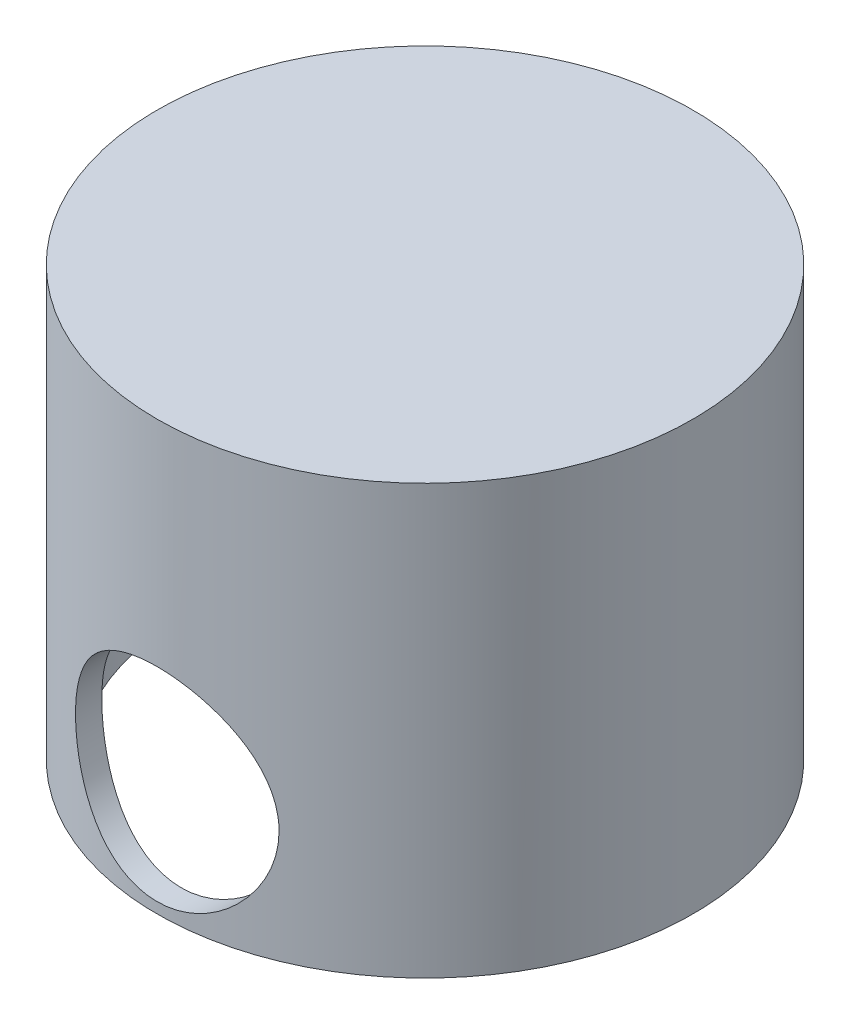
ISO-10303-21;
HEADER;
FILE_DESCRIPTION(('STEP AP214'),'2;1');
FILE_NAME('part.step','',(''),(''),'','','');
FILE_SCHEMA(('AUTOMOTIVE_DESIGN { 1 0 10303 214 1 1 1 1 }'));
ENDSEC;
DATA;
#1=APPLICATION_CONTEXT('core data for automotive mechanical design processes');
#2=APPLICATION_PROTOCOL_DEFINITION('international standard','automotive_design',2000,#1);
#3=PRODUCT_CONTEXT('',#1,'mechanical');
#4=PRODUCT('Part','Part','',(#3));
#5=PRODUCT_RELATED_PRODUCT_CATEGORY('part','',(#4));
#6=PRODUCT_DEFINITION_FORMATION('','',#4);
#7=PRODUCT_DEFINITION_CONTEXT('part definition',#1,'design');
#8=PRODUCT_DEFINITION('design','',#6,#7);
#9=PRODUCT_DEFINITION_SHAPE('','',#8);
#10=(LENGTH_UNIT() NAMED_UNIT(*) SI_UNIT(.MILLI.,.METRE.));
#11=(NAMED_UNIT(*) PLANE_ANGLE_UNIT() SI_UNIT($,.RADIAN.));
#12=(NAMED_UNIT(*) SI_UNIT($,.STERADIAN.) SOLID_ANGLE_UNIT());
#13=UNCERTAINTY_MEASURE_WITH_UNIT(LENGTH_MEASURE(1.E-05),#10,'distance_accuracy_value','');
#14=(GEOMETRIC_REPRESENTATION_CONTEXT(3) GLOBAL_UNCERTAINTY_ASSIGNED_CONTEXT((#13)) GLOBAL_UNIT_ASSIGNED_CONTEXT((#10,
#11,#12)) REPRESENTATION_CONTEXT('',''));
#15=CARTESIAN_POINT('',(0.,0.,0.));
#16=DIRECTION('',(0.,0.,1.));
#17=DIRECTION('',(1.,0.,0.));
#18=AXIS2_PLACEMENT_3D('',#15,#16,#17);
#19=CARTESIAN_POINT('',(0.,2.1,-5.));
#20=DIRECTION('',(0.,0.,1.));
#21=DIRECTION('',(1.,0.,0.));
#22=AXIS2_PLACEMENT_3D('',#19,#20,#21);
#23=CYLINDRICAL_SURFACE('',#22,1.9);
#24=DIRECTION('',(0.,0.,1.));
#25=VECTOR('',#24,1.);
#26=CARTESIAN_POINT('',(1.9,2.1,-5.));
#27=LINE('',#26,#25);
#28=CARTESIAN_POINT('',(1.9,2.1,-4.13430768085782));
#29=VERTEX_POINT('',#28);
#30=CARTESIAN_POINT('',(1.9,2.1,-4.62493243193887));
#31=VERTEX_POINT('',#30);
#32=EDGE_CURVE('E11',#29,#31,#27,.F.);
#33=ORIENTED_EDGE('',*,*,#32,.F.);
#34=CARTESIAN_POINT('',(0.,4.,-4.55));
#35=CARTESIAN_POINT('',(-0.101757167960576,3.9999889795849,-4.54999170850312));
#36=CARTESIAN_POINT('',(-0.203673371409378,3.99177693213572,-4.5465468918561));
#37=CARTESIAN_POINT('',(-0.404616385894816,3.95922077473532,-4.53309978978712));
#38=CARTESIAN_POINT('',(-0.503634972840385,3.93483467006331,-4.52308043479505));
#39=CARTESIAN_POINT('',(-0.695546176948673,3.87098905312328,-4.49756060096493));
#40=CARTESIAN_POINT('',(-0.788458342399915,3.83158069423824,-4.48207873608777));
#41=CARTESIAN_POINT('',(-0.96626256089563,3.7390208168186,-4.4471404091814));
#42=CARTESIAN_POINT('',(-1.05115701317986,3.68587342748924,-4.42768514170909));
#43=CARTESIAN_POINT('',(-1.2149286070869,3.56451621026312,-4.38564967784379));
#44=CARTESIAN_POINT('',(-1.2933487937799,3.49572558621654,-4.36296685170919));
#45=CARTESIAN_POINT('',(-1.43793251273584,3.34626276203829,-4.31747682569336));
#46=CARTESIAN_POINT('',(-1.50408956529537,3.26558432069696,-4.2946695665777));
#47=CARTESIAN_POINT('',(-1.62550335648133,3.08979827894359,-4.25025047951916));
#48=CARTESIAN_POINT('',(-1.68005895737734,2.99417431294387,-4.22875360419994));
#49=CARTESIAN_POINT('',(-1.77210709185766,2.7940793141977,-4.19101774379538));
#50=CARTESIAN_POINT('',(-1.80960845381103,2.68961289217239,-4.1747760395553));
#51=CARTESIAN_POINT('',(-1.86459451231666,2.48005802800511,-4.15050075712562));
#52=CARTESIAN_POINT('',(-1.88295887434288,2.37524356498495,-4.14210847599587));
#53=CARTESIAN_POINT('',(-1.90189382720715,2.16371077257113,-4.13345132468412));
#54=CARTESIAN_POINT('',(-1.902474293208,2.05699353270855,-4.13318194396401));
#55=CARTESIAN_POINT('',(-1.88648733592977,1.85346444730835,-4.14049758914471));
#56=CARTESIAN_POINT('',(-1.87123789727642,1.75652301089003,-4.14747894714587));
#57=CARTESIAN_POINT('',(-1.82623548584867,1.56672697765497,-4.16748891838456));
#58=CARTESIAN_POINT('',(-1.79647972110963,1.47387317131766,-4.18051869570993));
#59=CARTESIAN_POINT('',(-1.72272870001075,1.2925381245053,-4.21145201164279));
#60=CARTESIAN_POINT('',(-1.6784433333412,1.20419234499232,-4.22945355276891));
#61=CARTESIAN_POINT('',(-1.57709542377698,1.03584147997092,-4.26827952121988));
#62=CARTESIAN_POINT('',(-1.52002782955916,0.955839710245205,-4.28910506325543));
#63=CARTESIAN_POINT('',(-1.38904666480913,0.799297478555745,-4.33338389069071));
#64=CARTESIAN_POINT('',(-1.31411407931078,0.723627857703208,-4.35691014359209));
#65=CARTESIAN_POINT('',(-1.15239040690445,0.585635969571268,-4.40244803025189));
#66=CARTESIAN_POINT('',(-1.06559652575458,0.52331685626562,-4.42445930527452));
#67=CARTESIAN_POINT('',(-0.879957718349402,0.412510278329133,-4.46513139551705));
#68=CARTESIAN_POINT('',(-0.780879316950429,0.364378516750206,-4.48370230168852));
#69=CARTESIAN_POINT('',(-0.57505818498804,0.285771696418451,-4.51471053188253));
#70=CARTESIAN_POINT('',(-0.468319746428538,0.255286835399547,-4.52715126044226));
#71=CARTESIAN_POINT('',(-0.257484682399281,0.214665303488662,-4.54386054906135));
#72=CARTESIAN_POINT('',(-0.153650301043173,0.203360044435745,-4.54859763790352));
#73=CARTESIAN_POINT('',(0.0545315203191366,0.197932876602209,-4.55086253695219));
#74=CARTESIAN_POINT('',(0.158878803514811,0.203806006847307,-4.54839242853713));
#75=CARTESIAN_POINT('',(0.359642188179475,0.23173361848524,-4.53682417229059));
#76=CARTESIAN_POINT('',(0.456194247302778,0.252966144290898,-4.52806286584631));
#77=CARTESIAN_POINT('',(0.644259575701315,0.309864436431063,-4.50515369227797));
#78=CARTESIAN_POINT('',(0.735772207424184,0.345532024242481,-4.49100514538257));
#79=CARTESIAN_POINT('',(0.914372088887248,0.43145275537197,-4.45813067412324));
#80=CARTESIAN_POINT('',(1.00123338093964,0.482124786917805,-4.43927614505565));
#81=CARTESIAN_POINT('',(1.16553113437644,0.596155888338426,-4.39900035803063));
#82=CARTESIAN_POINT('',(1.24296363139076,0.659520265341447,-4.37757802789261));
#83=CARTESIAN_POINT('',(1.39204722706612,0.802456974479751,-4.33257393260414));
#84=CARTESIAN_POINT('',(1.46288460450262,0.882866140923004,-4.30894752657324));
#85=CARTESIAN_POINT('',(1.59028881663302,1.0548049569854,-4.2635743935834));
#86=CARTESIAN_POINT('',(1.64685235733206,1.14633716627881,-4.24182810126091));
#87=CARTESIAN_POINT('',(1.74472893227999,1.33984296017846,-4.20252961882294));
#88=CARTESIAN_POINT('',(1.78580869171692,1.44194881530045,-4.18504288675471));
#89=CARTESIAN_POINT('',(1.84984150114795,1.65258851632637,-4.15714193714009));
#90=CARTESIAN_POINT('',(1.8728095866381,1.7611169498519,-4.14672185418804));
#91=CARTESIAN_POINT('',(1.89846974756926,1.97248782936933,-4.13503242267552));
#92=CARTESIAN_POINT('',(1.90259102625123,2.07512190415627,-4.13311838719631));
#93=CARTESIAN_POINT('',(1.89425948511743,2.27955904421061,-4.13694365574339));
#94=CARTESIAN_POINT('',(1.88180923673045,2.38136223594131,-4.14268177237398));
#95=CARTESIAN_POINT('',(1.84189034924779,2.57632054160889,-4.16057445974201));
#96=CARTESIAN_POINT('',(1.81515446768803,2.66965726649533,-4.17241504348956));
#97=CARTESIAN_POINT('',(1.74814138788099,2.85054069180757,-4.20093092118913));
#98=CARTESIAN_POINT('',(1.70786038117534,2.93808575550838,-4.21760757470848));
#99=CARTESIAN_POINT('',(1.61210485242072,3.11066094857504,-4.25516286336975));
#100=CARTESIAN_POINT('',(1.55586087180969,3.19522141553677,-4.27623418824468));
#101=CARTESIAN_POINT('',(1.43085094651685,3.35415137715043,-4.31966905176211));
#102=CARTESIAN_POINT('',(1.36208062929742,3.42851729728029,-4.34203303976458));
#103=CARTESIAN_POINT('',(1.20798687649364,3.57055527060711,-4.38750210577242));
#104=CARTESIAN_POINT('',(1.12181966034007,3.63733728738289,-4.41054137295093));
#105=CARTESIAN_POINT('',(0.93864854177069,3.75554084710515,-4.45311875019328));
#106=CARTESIAN_POINT('',(0.84163973207037,3.80695539519317,-4.47265526428412));
#107=CARTESIAN_POINT('',(0.641027894236107,3.89185865375826,-4.50574656464846));
#108=CARTESIAN_POINT('',(0.53755904042552,3.92562741593749,-4.5193941626519));
#109=CARTESIAN_POINT('',(0.325906955654656,3.97497075796387,-4.53954766076462));
#110=CARTESIAN_POINT('',(0.217739584923597,3.9906022583564,-4.54607589980727));
#111=CARTESIAN_POINT('',(0.0727936798049418,3.99895808127257,-4.54956602726438));
#112=CARTESIAN_POINT('',(0.0364070188825854,4.00000394292086,-4.5500029665594));
#113=CARTESIAN_POINT('',(0.,4.,-4.55));
#114=B_SPLINE_CURVE_WITH_KNOTS('',3,(#34,#35,#36,#37,#38,#39,#40,#41,#42,#43,#44,#45,#46,#47,
#48,#49,#50,#51,#52,#53,#54,#55,#56,#57,#58,#59,#60,#61,#62,#63,#64,#65,#66,#67,#68,#69,#70,#71,
#72,#73,#74,#75,#76,#77,#78,#79,#80,#81,#82,#83,#84,#85,#86,#87,#88,#89,#90,#91,#92,#93,#94,#95,
#96,#97,#98,#99,#100,#101,#102,#103,#104,#105,#106,#107,#108,#109,#110,#111,#112,#113),
.UNSPECIFIED.,.T.,.F.,(4,2,2,2,2,2,2,2,2,2,2,2,2,2,2,2,2,2,2,2,2,2,2,2,2,2,2,2,2,2,2,2,2,2,2,2,
2,2,2,4),(0.,0.305167542847808,0.611130548354442,0.916060871304406,1.22089965511848,
1.53977252768732,1.85881341181118,2.19363714439877,2.52828735287146,2.84676687086272,
3.16506953817286,3.45884351782363,3.75267406111158,4.05277019531574,4.35298513240328,
4.67869399761883,5.00447972486523,5.33784834015083,5.67103160213475,5.98306984559692,
6.2950179839382,6.59140210527351,6.88782363727174,7.19345849820491,7.49922142389637,
7.82692788103995,8.15470989448137,8.48724959804015,8.81951295063518,9.12611005270941,
9.43265958519566,9.72481283008288,10.017048287951,10.3268986159551,10.6368573106543,
10.9695327374709,11.3023593593995,11.6297297475084,11.9560699394894,12.0652538006118),.UNSPECIFIED.);
#115=CARTESIAN_POINT('',(-1.9,2.1,-4.13430768085782));
#116=VERTEX_POINT('',#115);
#117=EDGE_CURVE('E96',#29,#116,#114,.T.);
#118=ORIENTED_EDGE('',*,*,#117,.T.);
#119=DIRECTION('',(0.,0.,1.));
#120=VECTOR('',#119,1.);
#121=CARTESIAN_POINT('',(-1.9,2.1,-5.));
#122=LINE('',#121,#120);
#123=CARTESIAN_POINT('',(-1.9,2.1,-4.62493243193887));
#124=VERTEX_POINT('',#123);
#125=EDGE_CURVE('E52',#116,#124,#122,.F.);
#126=ORIENTED_EDGE('',*,*,#125,.T.);
#127=CARTESIAN_POINT('',(0.,4.,-5.));
#128=CARTESIAN_POINT('',(-0.102799946037765,4.00000415381577,-5.00000314148827));
#129=CARTESIAN_POINT('',(-0.205571843604519,3.99163106638686,-4.99680228989486));
#130=CARTESIAN_POINT('',(-0.408038934279459,3.95849983997184,-4.98435404669264));
#131=CARTESIAN_POINT('',(-0.507734657550122,3.93374454106912,-4.97510770315697));
#132=CARTESIAN_POINT('',(-0.701099790647796,3.86885442206358,-4.9515593739685));
#133=CARTESIAN_POINT('',(-0.79478059792097,3.82874975542084,-4.93726730476453));
#134=CARTESIAN_POINT('',(-0.974076337852587,3.73445483907035,-4.90504670913707));
#135=CARTESIAN_POINT('',(-1.05968903835505,3.68026070680921,-4.88711718065938));
#136=CARTESIAN_POINT('',(-1.22413732997016,3.55686832356389,-4.84859789590344));
#137=CARTESIAN_POINT('',(-1.30257632185067,3.48716568208657,-4.82793146758365));
#138=CARTESIAN_POINT('',(-1.44697300442312,3.3358056302591,-4.7866396882284));
#139=CARTESIAN_POINT('',(-1.51292672431606,3.25414443122143,-4.76601435231863));
#140=CARTESIAN_POINT('',(-1.63303669782607,3.07727075960727,-4.72624148165763));
#141=CARTESIAN_POINT('',(-1.68662691351059,2.98165162326601,-4.70718397732858));
#142=CARTESIAN_POINT('',(-1.77678814062093,2.7819199845924,-4.67390104311853));
#143=CARTESIAN_POINT('',(-1.81336615777595,2.67781099922898,-4.65967362483106));
#144=CARTESIAN_POINT('',(-1.86688935206445,2.46862490700633,-4.63848318884947));
#145=CARTESIAN_POINT('',(-1.88459286653868,2.36377110298857,-4.63124079326371));
#146=CARTESIAN_POINT('',(-1.9022352797225,2.15235007582175,-4.62402433436697));
#147=CARTESIAN_POINT('',(-1.90218177025023,2.04578360439116,-4.62404716488918));
#148=CARTESIAN_POINT('',(-1.88489047329825,1.84096675039133,-4.63111820371223));
#149=CARTESIAN_POINT('',(-1.86871346296971,1.74260903735178,-4.63773273521278));
#150=CARTESIAN_POINT('',(-1.82139096396027,1.55012621654266,-4.65651975451297));
#151=CARTESIAN_POINT('',(-1.79024315879619,1.45600176626622,-4.66869310243304));
#152=CARTESIAN_POINT('',(-1.71329420545471,1.27252628717701,-4.69748147158025));
#153=CARTESIAN_POINT('',(-1.66722275924216,1.18330187807791,-4.71417741416087));
#154=CARTESIAN_POINT('',(-1.56192297174274,1.01354614235758,-4.75010374416888));
#155=CARTESIAN_POINT('',(-1.50269000311216,0.933017887974257,-4.76933502200296));
#156=CARTESIAN_POINT('',(-1.36792669110658,0.777081147725488,-4.80978709665352));
#157=CARTESIAN_POINT('',(-1.29155254717806,0.702411903464446,-4.83105350406012));
#158=CARTESIAN_POINT('',(-1.12712495183049,0.566718062548023,-4.87203874292135));
#159=CARTESIAN_POINT('',(-1.03906961144241,0.505695677025057,-4.89175732325386));
#160=CARTESIAN_POINT('',(-0.851852487995204,0.398182901674937,-4.92783612775859));
#161=CARTESIAN_POINT('',(-0.752533399397337,0.351944926685268,-4.94413653388479));
#162=CARTESIAN_POINT('',(-0.546752117350479,0.277080814368303,-4.97109705743368));
#163=CARTESIAN_POINT('',(-0.440293209930096,0.248446635933624,-4.98175974975373));
#164=CARTESIAN_POINT('',(-0.229470984419311,0.211038505057338,-4.9957875569285));
#165=CARTESIAN_POINT('',(-0.125308381952605,0.201269485913397,-4.99951788872478));
#166=CARTESIAN_POINT('',(0.0832228861010048,0.198963572059508,-5.00039355163115));
#167=CARTESIAN_POINT('',(0.187591499072482,0.206422734110037,-4.99754038959186));
#168=CARTESIAN_POINT('',(0.389231183311322,0.23760974501933,-4.98581030398745));
#169=CARTESIAN_POINT('',(0.48661956252922,0.260680395127365,-4.97717686326153));
#170=CARTESIAN_POINT('',(0.676070523965439,0.32156453246959,-4.95500073108836));
#171=CARTESIAN_POINT('',(0.768132412531035,0.359379934927776,-4.9414574019024));
#172=CARTESIAN_POINT('',(0.947380130569953,0.449893671543217,-4.91029493799233));
#173=CARTESIAN_POINT('',(1.0343402755648,0.503000255035508,-4.89256680627251));
#174=CARTESIAN_POINT('',(1.19840935888328,0.62212916627088,-4.85498822454556));
#175=CARTESIAN_POINT('',(1.27551457482178,0.688156350664691,-4.83513697776912));
#176=CARTESIAN_POINT('',(1.42249454419624,0.835879744125506,-4.79402533228151));
#177=CARTESIAN_POINT('',(1.4916645142899,0.918275267856926,-4.77275146045522));
#178=CARTESIAN_POINT('',(1.61534182230436,1.09391495424199,-4.73232674163432));
#179=CARTESIAN_POINT('',(1.66984764881774,1.18716023374311,-4.71317611359821));
#180=CARTESIAN_POINT('',(1.76275609269656,1.38273799327669,-4.67922676081744));
#181=CARTESIAN_POINT('',(1.80107453812967,1.48511469919419,-4.66445090027486));
#182=CARTESIAN_POINT('',(1.85966772399062,1.69558842965986,-4.64140564627876));
#183=CARTESIAN_POINT('',(1.87995403901349,1.80368173750899,-4.63313207948134));
#184=CARTESIAN_POINT('',(1.90085822079159,2.01486049983041,-4.62459224889872));
#185=CARTESIAN_POINT('',(1.90268207203628,2.11780766486938,-4.62383507549612));
#186=CARTESIAN_POINT('',(1.88971442556339,2.32246053023351,-4.62914978373433));
#187=CARTESIAN_POINT('',(1.87492459303962,2.42416635394587,-4.63522098096587));
#188=CARTESIAN_POINT('',(1.83009780463443,2.62011989436956,-4.65309482864238));
#189=CARTESIAN_POINT('',(1.80056695115268,2.71450229881234,-4.66470670311429));
#190=CARTESIAN_POINT('',(1.72754746605826,2.89702476865041,-4.69223770514172));
#191=CARTESIAN_POINT('',(1.68405526209124,2.98516322932584,-4.70815793493193));
#192=CARTESIAN_POINT('',(1.5816535247205,3.15781732736853,-4.74356958481196));
#193=CARTESIAN_POINT('',(1.52204449455647,3.24188789304858,-4.76320634926203));
#194=CARTESIAN_POINT('',(1.39017194395784,3.39921747533249,-4.80334974018232));
#195=CARTESIAN_POINT('',(1.3179043471688,3.47247299519233,-4.82385664524132));
#196=CARTESIAN_POINT('',(1.15791728108036,3.61029299174753,-4.86481333859486));
#197=CARTESIAN_POINT('',(1.06955792182773,3.67413824127065,-4.88519522839751));
#198=CARTESIAN_POINT('',(0.88264599508179,3.78606111869897,-4.92239876122345));
#199=CARTESIAN_POINT('',(0.784092165900098,3.83413679185081,-4.93921996278201));
#200=CARTESIAN_POINT('',(0.573841256525993,3.91495483162383,-4.96815335096176));
#201=CARTESIAN_POINT('',(0.461720234475095,3.94671559467441,-4.97995793401086));
#202=CARTESIAN_POINT('',(0.233052523820141,3.98923018017531,-4.99587741203959));
#203=CARTESIAN_POINT('',(0.11650824805077,3.99999529227576,-4.99999643959643));
#204=CARTESIAN_POINT('',(0.,4.,-5.));
#205=B_SPLINE_CURVE_WITH_KNOTS('',3,(#127,#128,#129,#130,#131,#132,#133,#134,#135,#136,#137,
#138,#139,#140,#141,#142,#143,#144,#145,#146,#147,#148,#149,#150,#151,#152,#153,#154,#155,#156,
#157,#158,#159,#160,#161,#162,#163,#164,#165,#166,#167,#168,#169,#170,#171,#172,#173,#174,#175,
#176,#177,#178,#179,#180,#181,#182,#183,#184,#185,#186,#187,#188,#189,#190,#191,#192,#193,#194,
#195,#196,#197,#198,#199,#200,#201,#202,#203,#204),.UNSPECIFIED.,.T.,.F.,(4,2,2,2,2,2,2,2,2,2,2,
2,2,2,2,2,2,2,2,2,2,2,2,2,2,2,2,2,2,2,2,2,2,2,2,2,2,2,4),(0.,0.307969989814319,
0.615886602745027,0.923201400237974,1.2306009726375,1.55003648986385,1.86957342987414,
2.20167819314484,2.53364607224951,2.85170573798024,3.16962942101276,3.46793160007379,
3.76627995133595,4.07036626171805,4.37455965276768,4.69979074570955,5.02507449610576,
5.35564718353277,5.68606875870782,5.99852705660325,6.31091384516212,6.6109067417509,
6.91093861797689,7.21987153759843,7.52892080407884,7.85638861100008,8.18389015653176,
8.51307430166362,8.84204699477762,9.14938038628981,9.45668297644511,9.75409402108917,
10.0515812263923,10.3649606558095,10.6784411868815,11.0095285310712,11.3406569004431,
11.6898823114545,12.0389198873331),.UNSPECIFIED.);
#206=EDGE_CURVE('E109',#31,#124,#205,.T.);
#207=ORIENTED_EDGE('',*,*,#206,.F.);
#208=EDGE_LOOP('',(#33,#118,#126,#207));
#209=FACE_BOUND('',#208,.T.);
#210=ADVANCED_FACE('F42',(#209),#23,.F.);
#211=CARTESIAN_POINT('',(0.,8.,0.));
#212=DIRECTION('',(0.,-1.,0.));
#213=DIRECTION('',(0.,0.,-1.));
#214=AXIS2_PLACEMENT_3D('',#211,#212,#213);
#215=CYLINDRICAL_SURFACE('',#214,5.);
#216=CARTESIAN_POINT('',(0.,0.,0.));
#217=DIRECTION('',(0.,1.,0.));
#218=DIRECTION('',(0.,0.,1.));
#219=AXIS2_PLACEMENT_3D('',#216,#217,#218);
#220=CIRCLE('',#219,5.);
#221=CARTESIAN_POINT('',(-1.9,0.,-4.62493243193887));
#222=VERTEX_POINT('',#221);
#223=CARTESIAN_POINT('',(1.9,0.,-4.62493243193887));
#224=VERTEX_POINT('',#223);
#225=EDGE_CURVE('E150',#222,#224,#220,.T.);
#226=ORIENTED_EDGE('',*,*,#225,.T.);
#227=DIRECTION('',(0.,-1.,0.));
#228=VECTOR('',#227,1.);
#229=CARTESIAN_POINT('',(1.9,8.,-4.62493243193887));
#230=LINE('',#229,#228);
#231=EDGE_CURVE('E112',#224,#31,#230,.F.);
#232=ORIENTED_EDGE('',*,*,#231,.T.);
#233=ORIENTED_EDGE('',*,*,#206,.T.);
#234=DIRECTION('',(0.,-1.,0.));
#235=VECTOR('',#234,1.);
#236=CARTESIAN_POINT('',(-1.9,8.,-4.62493243193887));
#237=LINE('',#236,#235);
#238=EDGE_CURVE('E59',#124,#222,#237,.T.);
#239=ORIENTED_EDGE('',*,*,#238,.T.);
#240=EDGE_LOOP('',(#226,#232,#233,#239));
#241=FACE_BOUND('',#240,.T.);
#242=CARTESIAN_POINT('',(1.9,2.1,4.62493243193887));
#243=CARTESIAN_POINT('',(1.90000436371933,1.9975038261634,4.62492829804688));
#244=CARTESIAN_POINT('',(1.89167872526175,1.89503593892056,4.62837659192631));
#245=CARTESIAN_POINT('',(1.85875324714,1.69319611435051,4.64169676380714));
#246=CARTESIAN_POINT('',(1.83415423094239,1.59382402063615,4.65156831677793));
#247=CARTESIAN_POINT('',(1.76972022747258,1.40114946112929,4.67645875021947));
#248=CARTESIAN_POINT('',(1.72992262911404,1.30783275281394,4.69146498987563));
#249=CARTESIAN_POINT('',(1.63635411050526,1.12916386760437,4.72491334314176));
#250=CARTESIAN_POINT('',(1.58257887568518,1.04381416101306,4.74335651715464));
#251=CARTESIAN_POINT('',(1.45964054880322,0.879143312499456,4.78265569638879));
#252=CARTESIAN_POINT('',(1.38987879516366,0.800286242306532,4.80358397927604));
#253=CARTESIAN_POINT('',(1.23821697454002,0.655062117415982,4.84489323856624));
#254=CARTESIAN_POINT('',(1.15631423523436,0.58869781978909,4.86527409330664));
#255=CARTESIAN_POINT('',(0.979156193501865,0.468090568785464,4.90405417834482));
#256=CARTESIAN_POINT('',(0.883533318585693,0.414354400385029,4.92235883280295));
#257=CARTESIAN_POINT('',(0.683785914181913,0.323924866971467,4.95405298729702));
#258=CARTESIAN_POINT('',(0.579664434268371,0.287225419969773,4.9674442410237));
#259=CARTESIAN_POINT('',(0.370755986482196,0.233545751921985,4.98728948637783));
#260=CARTESIAN_POINT('',(0.266201595779875,0.215766061526339,4.99402379560313));
#261=CARTESIAN_POINT('',(0.0553906936457078,0.197866496563972,5.00080378714205));
#262=CARTESIAN_POINT('',(-0.0508652375897353,0.197740725359082,5.00085170279789));
#263=CARTESIAN_POINT('',(-0.256323260168012,0.214692347151359,4.99443029769439));
#264=CARTESIAN_POINT('',(-0.355609552301661,0.230896484279847,4.98829179997241));
#265=CARTESIAN_POINT('',(-0.549931778782854,0.278575789481136,4.97062354756432));
#266=CARTESIAN_POINT('',(-0.644967410765378,0.31005204203452,4.95909341001728));
#267=CARTESIAN_POINT('',(-0.829748924435494,0.387775207466714,4.93156955201664));
#268=CARTESIAN_POINT('',(-0.919396692055944,0.434232136372366,4.91551280108484));
#269=CARTESIAN_POINT('',(-1.08984862618365,0.540410014323951,4.88055443322543));
#270=CARTESIAN_POINT('',(-1.17064988637925,0.600135302973585,4.86165188619363));
#271=CARTESIAN_POINT('',(-1.32625044008392,0.735336023185395,4.82160743227871));
#272=CARTESIAN_POINT('',(-1.4003998925035,0.811540816680054,4.80039921093498));
#273=CARTESIAN_POINT('',(-1.53511597678247,0.975422386495671,4.75903312517024));
#274=CARTESIAN_POINT('',(-1.59567900629084,1.06310219560745,4.73887554040363));
#275=CARTESIAN_POINT('',(-1.70279128624889,1.25007518702878,4.70146851970911));
#276=CARTESIAN_POINT('',(-1.74898072253503,1.34959154549665,4.68429788162558));
#277=CARTESIAN_POINT('',(-1.82369722844141,1.55581497537522,4.65572204531014));
#278=CARTESIAN_POINT('',(-1.85223444446237,1.66251787681258,4.6443135357312));
#279=CARTESIAN_POINT('',(-1.88933823586824,1.87365054017526,4.62933918969668));
#280=CARTESIAN_POINT('',(-1.89893991981769,1.97786935740306,4.62536749644316));
#281=CARTESIAN_POINT('',(-1.90089286223105,2.18648191375099,4.62456606150656));
#282=CARTESIAN_POINT('',(-1.89324860043378,2.29087560040897,4.62773446513985));
#283=CARTESIAN_POINT('',(-1.86186599549396,2.4914813793072,4.64044316636142));
#284=CARTESIAN_POINT('',(-1.83893905979756,2.58784317266787,4.64966187084544));
#285=CARTESIAN_POINT('',(-1.77866899519103,2.77530426535132,4.67304760489538));
#286=CARTESIAN_POINT('',(-1.74132286483977,2.86640246448381,4.68721566464055));
#287=CARTESIAN_POINT('',(-1.65167467634745,3.04461530013403,4.71956753441647));
#288=CARTESIAN_POINT('',(-1.59885667228876,3.13144561965926,4.73788385975928));
#289=CARTESIAN_POINT('',(-1.48030867163641,3.29537740657105,4.77624987803754));
#290=CARTESIAN_POINT('',(-1.4145738407436,3.37247521363335,4.79630021837397));
#291=CARTESIAN_POINT('',(-1.26697281700303,3.51998659773042,4.83745967368334));
#292=CARTESIAN_POINT('',(-1.18433273598475,3.58963314293941,4.85855226248339));
#293=CARTESIAN_POINT('',(-1.00802303438766,3.71416713674265,4.89816727719558));
#294=CARTESIAN_POINT('',(-0.914353305313361,3.76905444013701,4.91668967782161));
#295=CARTESIAN_POINT('',(-0.718633570628771,3.86217769963705,4.94907709499008));
#296=CARTESIAN_POINT('',(-0.616608693340421,3.90046155215214,4.96295548142365));
#297=CARTESIAN_POINT('',(-0.40691732110059,3.9591005132859,4.98452633675954));
#298=CARTESIAN_POINT('',(-0.299253584501062,3.97946430263207,4.9922218005981));
#299=CARTESIAN_POINT('',(-0.0882642447406516,4.00073037539106,5.00026892414284));
#300=CARTESIAN_POINT('',(0.0149369093800086,4.00272135690731,5.00103136453917));
#301=CARTESIAN_POINT('',(0.220142388055173,3.99000032082682,4.99620513987148));
#302=CARTESIAN_POINT('',(0.322146861937919,3.97529041014643,4.99061727593584));
#303=CARTESIAN_POINT('',(0.519407606898042,3.93035293364923,4.97390940348736));
#304=CARTESIAN_POINT('',(0.614769759262804,3.90053201447966,4.96293459211061));
#305=CARTESIAN_POINT('',(0.799140086918489,3.8266281674512,4.93660372798975));
#306=CARTESIAN_POINT('',(0.888147054830509,3.7825425382896,4.9212468454796));
#307=CARTESIAN_POINT('',(1.06142963602304,3.6792312839046,4.88687043945404));
#308=CARTESIAN_POINT('',(1.14534300447175,3.61944147415112,4.86772291667929));
#309=CARTESIAN_POINT('',(1.30227863688837,3.48730039713511,4.82810857470437));
#310=CARTESIAN_POINT('',(1.37529695534045,3.41494459967323,4.80764128138886));
#311=CARTESIAN_POINT('',(1.51247406818991,3.25503702189524,4.76632308196754));
#312=CARTESIAN_POINT('',(1.57593248134987,3.16687169103089,4.74551213385258));
#313=CARTESIAN_POINT('',(1.68717136580017,2.98047349739798,4.70711465940726));
#314=CARTESIAN_POINT('',(1.73494938708525,2.8822390645119,4.68952863714928));
#315=CARTESIAN_POINT('',(1.8153300640006,2.67258598801878,4.65902866082262));
#316=CARTESIAN_POINT('',(1.84694547468596,2.56073844854633,4.64642747848822));
#317=CARTESIAN_POINT('',(1.88927053159533,2.33257964869159,4.62938461098142));
#318=CARTESIAN_POINT('',(1.89999504979831,2.21627162386644,4.62493712142451));
#319=CARTESIAN_POINT('',(1.9,2.1,4.62493243193887));
#320=B_SPLINE_CURVE_WITH_KNOTS('',3,(#242,#243,#244,#245,#246,#247,#248,#249,#250,#251,#252,
#253,#254,#255,#256,#257,#258,#259,#260,#261,#262,#263,#264,#265,#266,#267,#268,#269,#270,#271,
#272,#273,#274,#275,#276,#277,#278,#279,#280,#281,#282,#283,#284,#285,#286,#287,#288,#289,#290,
#291,#292,#293,#294,#295,#296,#297,#298,#299,#300,#301,#302,#303,#304,#305,#306,#307,#308,#309,
#310,#311,#312,#313,#314,#315,#316,#317,#318,#319),.UNSPECIFIED.,.T.,.F.,(4,2,2,2,2,2,2,2,2,2,2,
2,2,2,2,2,2,2,2,2,2,2,2,2,2,2,2,2,2,2,2,2,2,2,2,2,2,2,4),(0.,0.307055262679175,
0.614094988915585,0.920384204748322,1.22676807741567,1.54738115755826,1.86806491210606,
2.19999633923146,2.53180917789548,2.84896440658,3.16601370104911,3.46696316769757,
3.76793400804709,4.07332236002851,4.37881074100048,4.70260581420842,5.02648663835537,
5.35792185020603,5.689166377432,6.00173780540237,6.31422805040052,6.61132384190777,
6.9084815090414,7.21696915536267,7.52557247806822,7.85436073131818,8.18315221903456,
8.51098882030871,8.83866652542134,9.14679294287423,9.45488049267541,9.75508565191428,
10.0553476941945,10.3683804775257,10.6815263483378,11.0117508535567,11.3420269306387,
11.6905985483952,12.0389219313281),.UNSPECIFIED.);
#321=CARTESIAN_POINT('',(1.9,2.1,4.62493243193887));
#322=VERTEX_POINT('',#321);
#323=EDGE_CURVE('E103',#322,#322,#320,.T.);
#324=ORIENTED_EDGE('',*,*,#323,.T.);
#325=EDGE_LOOP('',(#324));
#326=FACE_BOUND('',#325,.T.);
#327=CARTESIAN_POINT('',(0.,8.,0.));
#328=DIRECTION('',(0.,1.,0.));
#329=DIRECTION('',(0.,0.,1.));
#330=AXIS2_PLACEMENT_3D('',#327,#328,#329);
#331=CIRCLE('',#330,5.);
#332=CARTESIAN_POINT('',(0.,8.,5.));
#333=VERTEX_POINT('',#332);
#334=EDGE_CURVE('E90',#333,#333,#331,.T.);
#335=ORIENTED_EDGE('',*,*,#334,.F.);
#336=EDGE_LOOP('',(#335));
#337=FACE_BOUND('',#336,.T.);
#338=ADVANCED_FACE('F44',(#241,#326,#337),#215,.T.);
#339=CARTESIAN_POINT('',(0.,8.,0.));
#340=DIRECTION('',(0.,1.,0.));
#341=DIRECTION('',(0.,0.,1.));
#342=AXIS2_PLACEMENT_3D('',#339,#340,#341);
#343=PLANE('',#342);
#344=ORIENTED_EDGE('',*,*,#334,.T.);
#345=EDGE_LOOP('',(#344));
#346=FACE_BOUND('',#345,.T.);
#347=ADVANCED_FACE('F191',(#346),#343,.T.);
#348=CARTESIAN_POINT('',(0.,0.,0.));
#349=DIRECTION('',(0.,1.,0.));
#350=DIRECTION('',(0.,0.,1.));
#351=AXIS2_PLACEMENT_3D('',#348,#349,#350);
#352=PLANE('',#351);
#353=CARTESIAN_POINT('',(0.,0.,0.));
#354=DIRECTION('',(0.,1.,0.));
#355=DIRECTION('',(0.,0.,1.));
#356=AXIS2_PLACEMENT_3D('',#353,#354,#355);
#357=CIRCLE('',#356,4.55);
#358=CARTESIAN_POINT('',(-1.9,0.,-4.13430768085782));
#359=VERTEX_POINT('',#358);
#360=CARTESIAN_POINT('',(1.9,0.,-4.13430768085782));
#361=VERTEX_POINT('',#360);
#362=EDGE_CURVE('E98',#359,#361,#357,.T.);
#363=ORIENTED_EDGE('',*,*,#362,.T.);
#364=DIRECTION('',(0.,0.,1.));
#365=VECTOR('',#364,1.);
#366=CARTESIAN_POINT('',(1.9,0.,-10.));
#367=LINE('',#366,#365);
#368=EDGE_CURVE('E100',#224,#361,#367,.T.);
#369=ORIENTED_EDGE('',*,*,#368,.F.);
#370=ORIENTED_EDGE('',*,*,#225,.F.);
#371=DIRECTION('',(0.,0.,1.));
#372=VECTOR('',#371,1.);
#373=CARTESIAN_POINT('',(-1.9,0.,-10.));
#374=LINE('',#373,#372);
#375=EDGE_CURVE('E164',#222,#359,#374,.T.);
#376=ORIENTED_EDGE('',*,*,#375,.T.);
#377=EDGE_LOOP('',(#363,#369,#370,#376));
#378=FACE_BOUND('',#377,.T.);
#379=ADVANCED_FACE('F163',(#378),#352,.F.);
#380=CARTESIAN_POINT('',(0.,7.1,0.));
#381=DIRECTION('',(0.,-1.,0.));
#382=DIRECTION('',(0.,0.,-1.));
#383=AXIS2_PLACEMENT_3D('',#380,#381,#382);
#384=CYLINDRICAL_SURFACE('',#383,4.55);
#385=DIRECTION('',(0.,-1.,0.));
#386=VECTOR('',#385,1.);
#387=CARTESIAN_POINT('',(1.9,7.1,-4.13430768085782));
#388=LINE('',#387,#386);
#389=EDGE_CURVE('E66',#361,#29,#388,.F.);
#390=ORIENTED_EDGE('',*,*,#389,.F.);
#391=ORIENTED_EDGE('',*,*,#362,.F.);
#392=DIRECTION('',(0.,-1.,0.));
#393=VECTOR('',#392,1.);
#394=CARTESIAN_POINT('',(-1.9,7.1,-4.13430768085782));
#395=LINE('',#394,#393);
#396=EDGE_CURVE('E83',#116,#359,#395,.T.);
#397=ORIENTED_EDGE('',*,*,#396,.F.);
#398=ORIENTED_EDGE('',*,*,#117,.F.);
#399=EDGE_LOOP('',(#390,#391,#397,#398));
#400=FACE_BOUND('',#399,.T.);
#401=CARTESIAN_POINT('',(1.9,2.1,4.13430768085782));
#402=CARTESIAN_POINT('',(1.89998865502678,1.99868154071265,4.13431867398463));
#403=CARTESIAN_POINT('',(1.89184436655612,1.89719856106065,4.13808650067811));
#404=CARTESIAN_POINT('',(1.85958229198709,1.69716270406282,4.1526793207837));
#405=CARTESIAN_POINT('',(1.83542121648697,1.59861852593158,4.16352343840862));
#406=CARTESIAN_POINT('',(1.77223211089975,1.40771582998863,4.19080702936458));
#407=CARTESIAN_POINT('',(1.73326486599501,1.31533381307548,4.20722359658192));
#408=CARTESIAN_POINT('',(1.64174795884519,1.13844500164098,4.24376974441837));
#409=CARTESIAN_POINT('',(1.58920146792889,1.05393637461094,4.2638984577803));
#410=CARTESIAN_POINT('',(1.46850615022899,0.889859868439094,4.3070078930429));
#411=CARTESIAN_POINT('',(1.39964175513233,0.81084358533938,4.33008560319352));
#412=CARTESIAN_POINT('',(1.24976790262815,0.665073363662112,4.37569572086495));
#413=CARTESIAN_POINT('',(1.1687537724024,0.598324165113308,4.39822791468937));
#414=CARTESIAN_POINT('',(0.992543271529516,0.476165421113531,4.44138796555988));
#415=CARTESIAN_POINT('',(0.896882569408638,0.42137714897996,4.46188996593486));
#416=CARTESIAN_POINT('',(0.696691420740699,0.328909536745468,4.49749181854646));
#417=CARTESIAN_POINT('',(0.592164952720839,0.291222570114727,4.51259407822296));
#418=CARTESIAN_POINT('',(0.383001277246681,0.236028526465033,4.53500685733221));
#419=CARTESIAN_POINT('',(0.278655118433232,0.217570087095366,4.54268320803585));
#420=CARTESIAN_POINT('',(0.0680831746139525,0.198282378133597,4.55070848977934));
#421=CARTESIAN_POINT('',(-0.0381418267601874,0.197445924522148,4.55106040679714));
#422=CARTESIAN_POINT('',(-0.242536331430811,0.212928725815592,4.54461213884815));
#423=CARTESIAN_POINT('',(-0.340801357685928,0.228202516725632,4.53824778896743));
#424=CARTESIAN_POINT('',(-0.53322488942584,0.273679296977277,4.519681230454));
#425=CARTESIAN_POINT('',(-0.627383091553872,0.303883387142439,4.50747859136142));
#426=CARTESIAN_POINT('',(-0.810648636362675,0.378721677045703,4.47818037069684));
#427=CARTESIAN_POINT('',(-0.89965695280301,0.423569087151767,4.46101295088542));
#428=CARTESIAN_POINT('',(-1.06911771291616,0.526211486181433,4.42346375424811));
#429=CARTESIAN_POINT('',(-1.14956711362552,0.584011057468919,4.40308084056531));
#430=CARTESIAN_POINT('',(-1.30567503701411,0.715672667033552,4.35944259271389));
#431=CARTESIAN_POINT('',(-1.38059182720942,0.790381846112748,4.33608606280541));
#432=CARTESIAN_POINT('',(-1.51715468516137,0.951353490782896,4.29021471811929));
#433=CARTESIAN_POINT('',(-1.57879558678445,1.03762043281703,4.26770023381843));
#434=CARTESIAN_POINT('',(-1.68897281023175,1.22286891816926,4.22533774246502));
#435=CARTESIAN_POINT('',(-1.73700725378551,1.32217703704684,4.20560280376281));
#436=CARTESIAN_POINT('',(-1.81536796981792,1.52851562263847,4.17238205169634));
#437=CARTESIAN_POINT('',(-1.8457069690512,1.63554047699039,4.15889174856732));
#438=CARTESIAN_POINT('',(-1.88592485220317,1.84684109582637,4.14080255586563));
#439=CARTESIAN_POINT('',(-1.89700684415336,1.95084243552894,4.13568212334259));
#440=CARTESIAN_POINT('',(-1.90193111736957,2.15932232199747,4.1334212355768));
#441=CARTESIAN_POINT('',(-1.89577940673886,2.2638006897806,4.13627799928117));
#442=CARTESIAN_POINT('',(-1.86750896618156,2.46317544068055,4.14911058575225));
#443=CARTESIAN_POINT('',(-1.84644451151384,2.5582554817877,4.15861587603762));
#444=CARTESIAN_POINT('',(-1.79034520507425,2.74345253746825,4.18307223636401));
#445=CARTESIAN_POINT('',(-1.75530707828923,2.83356838294279,4.19802458296188));
#446=CARTESIAN_POINT('',(-1.67060576871018,3.01055389344604,4.23246318421008));
#447=CARTESIAN_POINT('',(-1.6203849908144,3.09712346241201,4.25211493114523));
#448=CARTESIAN_POINT('',(-1.50729789464784,3.26102383910877,4.29350381557841));
#449=CARTESIAN_POINT('',(-1.44442608615064,3.338350612396,4.31524185632537));
#450=CARTESIAN_POINT('',(-1.30175746082518,3.48815682480703,4.36050070031968));
#451=CARTESIAN_POINT('',(-1.22099662957974,3.55972170953031,4.38402181517014));
#452=CARTESIAN_POINT('',(-1.04806827270063,3.68844896630672,4.42854560120547));
#453=CARTESIAN_POINT('',(-0.95589988965095,3.74561025477324,4.4495480828506));
#454=CARTESIAN_POINT('',(-0.76210191938803,3.84385427978454,4.48680854537267));
#455=CARTESIAN_POINT('',(-0.660447189147642,3.88489269428885,4.50305341676579));
#456=CARTESIAN_POINT('',(-0.450823921978433,3.94898629900807,4.52883877444021));
#457=CARTESIAN_POINT('',(-0.342859202705241,3.97205224425268,4.53838327000056));
#458=CARTESIAN_POINT('',(-0.131853653605856,3.99818734733231,4.54922945927491));
#459=CARTESIAN_POINT('',(-0.0289987487618533,4.00254583572596,4.55106244320507));
#460=CARTESIAN_POINT('',(0.175940813810788,3.99461205291276,4.54775110757909));
#461=CARTESIAN_POINT('',(0.278025604415782,3.98232272342141,4.54260802071375));
#462=CARTESIAN_POINT('',(0.474764679899184,3.94236780288877,4.52620218580914));
#463=CARTESIAN_POINT('',(0.569554134247889,3.91526757447462,4.51516477078214));
#464=CARTESIAN_POINT('',(0.753204213640724,3.84707861240844,4.48818518114238));
#465=CARTESIAN_POINT('',(0.84206371119226,3.80598722755911,4.47224207700119));
#466=CARTESIAN_POINT('',(1.01576013491128,3.70890494517629,4.43609707018431));
#467=CARTESIAN_POINT('',(1.10023327874353,3.65232415279083,4.41573514442539));
#468=CARTESIAN_POINT('',(1.25884678070357,3.52672624607773,4.37316360812082));
#469=CARTESIAN_POINT('',(1.33298326410706,3.45770449033185,4.350953309663));
#470=CARTESIAN_POINT('',(1.47409294856122,3.30361754990313,4.30527840897348));
#471=CARTESIAN_POINT('',(1.54022937331342,3.21777793396789,4.28183192002089));
#472=CARTESIAN_POINT('',(1.6572831081025,3.03549114869578,4.23790480998547));
#473=CARTESIAN_POINT('',(1.70819188758076,2.93903807490529,4.21742585462032));
#474=CARTESIAN_POINT('',(1.79280675207637,2.73846278670155,4.18215797221989));
#475=CARTESIAN_POINT('',(1.8265999919058,2.63438258040173,4.16734031387604));
#476=CARTESIAN_POINT('',(1.87578479489198,2.42139036561416,4.14544181169576));
#477=CARTESIAN_POINT('',(1.89123808008713,2.31249585039503,4.13833502434406));
#478=CARTESIAN_POINT('',(1.89906911164383,2.16881995053103,4.13473377569335));
#479=CARTESIAN_POINT('',(1.90000385406522,2.1344194686449,4.13430394632035));
#480=CARTESIAN_POINT('',(1.9,2.1,4.13430768085782));
#481=B_SPLINE_CURVE_WITH_KNOTS('',3,(#401,#402,#403,#404,#405,#406,#407,#408,#409,#410,#411,
#412,#413,#414,#415,#416,#417,#418,#419,#420,#421,#422,#423,#424,#425,#426,#427,#428,#429,#430,
#431,#432,#433,#434,#435,#436,#437,#438,#439,#440,#441,#442,#443,#444,#445,#446,#447,#448,#449,
#450,#451,#452,#453,#454,#455,#456,#457,#458,#459,#460,#461,#462,#463,#464,#465,#466,#467,#468,
#469,#470,#471,#472,#473,#474,#475,#476,#477,#478,#479,#480),.UNSPECIFIED.,.T.,.F.,(4,2,2,2,2,2,
2,2,2,2,2,2,2,2,2,2,2,2,2,2,2,2,2,2,2,2,2,2,2,2,2,2,2,2,2,2,2,2,2,4),(0.,0.303856425206547,
0.608537465597874,0.911980953115792,1.21535363767726,1.53592274251996,1.85661545672793,
2.19128994131183,2.52581502680596,2.84286424764864,3.15978421337429,3.45733343997605,
3.7549046084063,4.05701760393462,4.35923765368353,4.68284132949354,5.0065707047081,
5.34102648991654,5.67524143335089,5.98770441897236,6.30005848567543,6.59228789536452,
6.88458583522347,7.18928932044731,7.49412532555878,7.82390789763808,8.15371527195128,
8.48442305211519,8.81493277883233,9.12225598701233,9.42952489741361,9.72580979971903,
10.0221508766013,10.3318968573458,10.6417586368059,10.9728141705333,11.3040548164121,
11.6335913372717,11.9620156486966,12.0652404388633),.UNSPECIFIED.);
#482=CARTESIAN_POINT('',(1.9,2.1,4.13430768085782));
#483=VERTEX_POINT('',#482);
#484=EDGE_CURVE('E104',#483,#483,#481,.T.);
#485=ORIENTED_EDGE('',*,*,#484,.F.);
#486=EDGE_LOOP('',(#485));
#487=FACE_BOUND('',#486,.T.);
#488=CARTESIAN_POINT('',(0.,7.1,0.));
#489=DIRECTION('',(0.,1.,0.));
#490=DIRECTION('',(0.,0.,1.));
#491=AXIS2_PLACEMENT_3D('',#488,#489,#490);
#492=CIRCLE('',#491,4.55);
#493=CARTESIAN_POINT('',(0.,7.1,4.55));
#494=VERTEX_POINT('',#493);
#495=EDGE_CURVE('E146',#494,#494,#492,.T.);
#496=ORIENTED_EDGE('',*,*,#495,.T.);
#497=EDGE_LOOP('',(#496));
#498=FACE_BOUND('',#497,.T.);
#499=ADVANCED_FACE('F94',(#400,#487,#498),#384,.F.);
#500=CARTESIAN_POINT('',(0.,7.1,0.));
#501=DIRECTION('',(0.,1.,0.));
#502=DIRECTION('',(0.,0.,1.));
#503=AXIS2_PLACEMENT_3D('',#500,#501,#502);
#504=PLANE('',#503);
#505=ORIENTED_EDGE('',*,*,#495,.F.);
#506=EDGE_LOOP('',(#505));
#507=FACE_BOUND('',#506,.T.);
#508=ADVANCED_FACE('F131',(#507),#504,.F.);
#509=ORIENTED_EDGE('',*,*,#484,.T.);
#510=EDGE_LOOP('',(#509));
#511=FACE_BOUND('',#510,.T.);
#512=ORIENTED_EDGE('',*,*,#323,.F.);
#513=EDGE_LOOP('',(#512));
#514=FACE_BOUND('',#513,.T.);
#515=ADVANCED_FACE('F129',(#511,#514),#23,.F.);
#516=CARTESIAN_POINT('',(-1.9,2.1,-10.));
#517=DIRECTION('',(-1.,0.,0.));
#518=DIRECTION('',(0.,-1.,0.));
#519=AXIS2_PLACEMENT_3D('',#516,#517,#518);
#520=PLANE('',#519);
#521=ORIENTED_EDGE('',*,*,#125,.F.);
#522=ORIENTED_EDGE('',*,*,#396,.T.);
#523=ORIENTED_EDGE('',*,*,#375,.F.);
#524=ORIENTED_EDGE('',*,*,#238,.F.);
#525=EDGE_LOOP('',(#521,#522,#523,#524));
#526=FACE_BOUND('',#525,.T.);
#527=ADVANCED_FACE('F82',(#526),#520,.F.);
#528=CARTESIAN_POINT('',(1.9,2.1,-10.));
#529=DIRECTION('',(1.,0.,0.));
#530=DIRECTION('',(0.,1.,0.));
#531=AXIS2_PLACEMENT_3D('',#528,#529,#530);
#532=PLANE('',#531);
#533=ORIENTED_EDGE('',*,*,#368,.T.);
#534=ORIENTED_EDGE('',*,*,#389,.T.);
#535=ORIENTED_EDGE('',*,*,#32,.T.);
#536=ORIENTED_EDGE('',*,*,#231,.F.);
#537=EDGE_LOOP('',(#533,#534,#535,#536));
#538=FACE_BOUND('',#537,.T.);
#539=ADVANCED_FACE('F173',(#538),#532,.F.);
#540=CLOSED_SHELL('',(#210,#338,#347,#379,#499,#508,#515,#527,#539));
#541=MANIFOLD_SOLID_BREP('B2',#540);
#542=ADVANCED_BREP_SHAPE_REPRESENTATION('',(#18,#541),#14);
#543=SHAPE_DEFINITION_REPRESENTATION(#9,#542);
ENDSEC;
END-ISO-10303-21;
